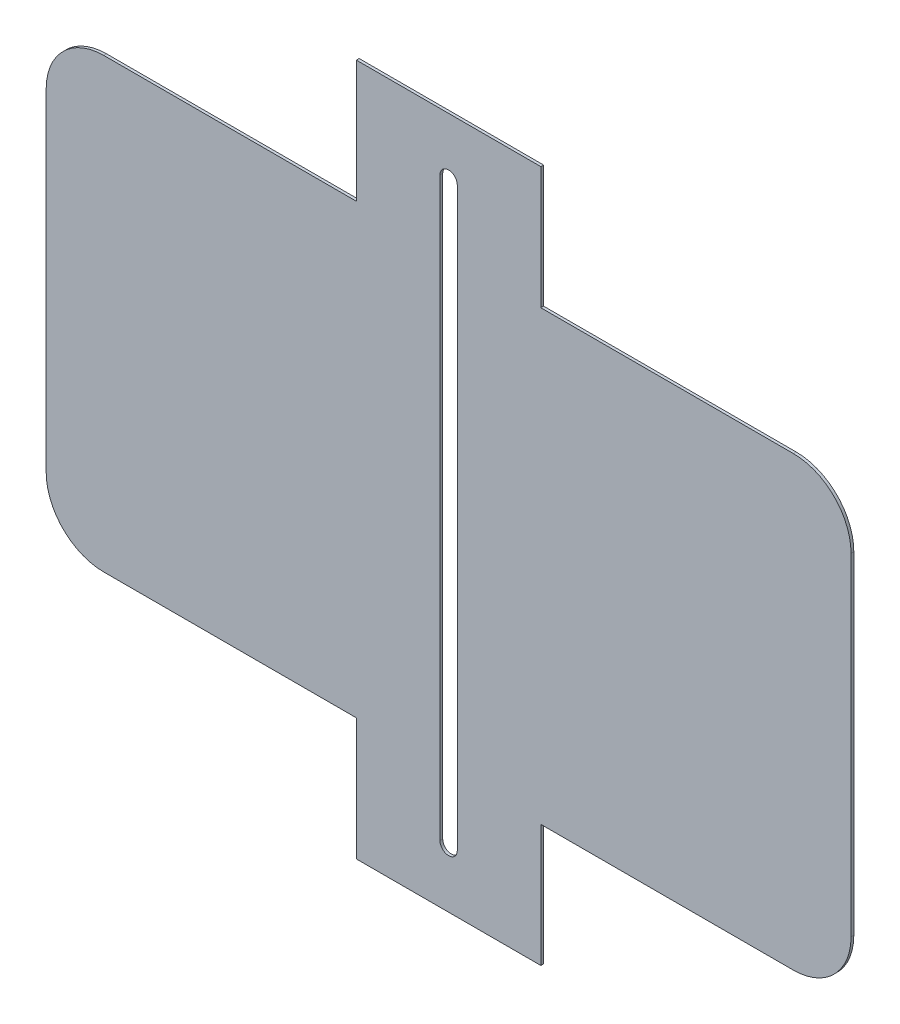
ISO-10303-21;
HEADER;
FILE_DESCRIPTION(('STEP AP214'),'2;1');
FILE_NAME('part.step','',(''),(''),'','','');
FILE_SCHEMA(('AUTOMOTIVE_DESIGN { 1 0 10303 214 1 1 1 1 }'));
ENDSEC;
DATA;
#1=APPLICATION_CONTEXT('core data for automotive mechanical design processes');
#2=APPLICATION_PROTOCOL_DEFINITION('international standard','automotive_design',2000,#1);
#3=PRODUCT_CONTEXT('',#1,'mechanical');
#4=PRODUCT('Part','Part','',(#3));
#5=PRODUCT_RELATED_PRODUCT_CATEGORY('part','',(#4));
#6=PRODUCT_DEFINITION_FORMATION('','',#4);
#7=PRODUCT_DEFINITION_CONTEXT('part definition',#1,'design');
#8=PRODUCT_DEFINITION('design','',#6,#7);
#9=PRODUCT_DEFINITION_SHAPE('','',#8);
#10=(LENGTH_UNIT() NAMED_UNIT(*) SI_UNIT(.MILLI.,.METRE.));
#11=(NAMED_UNIT(*) PLANE_ANGLE_UNIT() SI_UNIT($,.RADIAN.));
#12=(NAMED_UNIT(*) SI_UNIT($,.STERADIAN.) SOLID_ANGLE_UNIT());
#13=UNCERTAINTY_MEASURE_WITH_UNIT(LENGTH_MEASURE(1.E-05),#10,'distance_accuracy_value','');
#14=(GEOMETRIC_REPRESENTATION_CONTEXT(3) GLOBAL_UNCERTAINTY_ASSIGNED_CONTEXT((#13)) GLOBAL_UNIT_ASSIGNED_CONTEXT((#10,
#11,#12)) REPRESENTATION_CONTEXT('',''));
#15=CARTESIAN_POINT('',(0.,0.,0.));
#16=DIRECTION('',(0.,0.,1.));
#17=DIRECTION('',(1.,0.,0.));
#18=AXIS2_PLACEMENT_3D('',#15,#16,#17);
#19=CARTESIAN_POINT('',(0.750000000000006,0.,0.24));
#20=DIRECTION('',(-1.,0.,0.));
#21=DIRECTION('',(0.,0.,1.));
#22=AXIS2_PLACEMENT_3D('',#19,#20,#21);
#23=PLANE('',#22);
#24=DIRECTION('',(0.,1.,0.));
#25=VECTOR('',#24,1.);
#26=CARTESIAN_POINT('',(0.750000000000006,0.,0.));
#27=LINE('',#26,#25);
#28=CARTESIAN_POINT('',(0.750000000000006,-25.,0.));
#29=VERTEX_POINT('',#28);
#30=CARTESIAN_POINT('',(0.750000000000006,25.,0.));
#31=VERTEX_POINT('',#30);
#32=EDGE_CURVE('E310',#29,#31,#27,.T.);
#33=ORIENTED_EDGE('',*,*,#32,.F.);
#34=DIRECTION('',(0.,0.,-1.));
#35=VECTOR('',#34,1.);
#36=CARTESIAN_POINT('',(0.750000000000006,-25.,0.24));
#37=LINE('',#36,#35);
#38=CARTESIAN_POINT('',(0.750000000000006,-25.,0.24));
#39=VERTEX_POINT('',#38);
#40=EDGE_CURVE('E11',#39,#29,#37,.T.);
#41=ORIENTED_EDGE('',*,*,#40,.F.);
#42=DIRECTION('',(0.,1.,0.));
#43=VECTOR('',#42,1.);
#44=CARTESIAN_POINT('',(0.750000000000006,0.,0.24));
#45=LINE('',#44,#43);
#46=CARTESIAN_POINT('',(0.750000000000006,25.,0.24));
#47=VERTEX_POINT('',#46);
#48=EDGE_CURVE('E286',#39,#47,#45,.T.);
#49=ORIENTED_EDGE('',*,*,#48,.T.);
#50=DIRECTION('',(0.,0.,-1.));
#51=VECTOR('',#50,1.);
#52=CARTESIAN_POINT('',(0.750000000000006,25.,0.24));
#53=LINE('',#52,#51);
#54=EDGE_CURVE('E321',#47,#31,#53,.T.);
#55=ORIENTED_EDGE('',*,*,#54,.T.);
#56=EDGE_LOOP('',(#33,#41,#49,#55));
#57=FACE_BOUND('',#56,.T.);
#58=ADVANCED_FACE('F38',(#57),#23,.T.);
#59=CARTESIAN_POINT('',(0.,-25.,0.24));
#60=DIRECTION('',(0.,0.,-1.));
#61=DIRECTION('',(-1.,0.,0.));
#62=AXIS2_PLACEMENT_3D('',#59,#60,#61);
#63=CYLINDRICAL_SURFACE('',#62,0.750000000000006);
#64=CARTESIAN_POINT('',(0.,-25.,0.));
#65=DIRECTION('',(0.,0.,1.));
#66=DIRECTION('',(1.,0.,0.));
#67=AXIS2_PLACEMENT_3D('',#64,#65,#66);
#68=CIRCLE('',#67,0.750000000000006);
#69=CARTESIAN_POINT('',(-0.750000000000006,-25.,0.));
#70=VERTEX_POINT('',#69);
#71=EDGE_CURVE('E313',#29,#70,#68,.F.);
#72=ORIENTED_EDGE('',*,*,#71,.T.);
#73=DIRECTION('',(0.,0.,-1.));
#74=VECTOR('',#73,1.);
#75=CARTESIAN_POINT('',(-0.750000000000006,-25.,0.24));
#76=LINE('',#75,#74);
#77=CARTESIAN_POINT('',(-0.750000000000006,-25.,0.24));
#78=VERTEX_POINT('',#77);
#79=EDGE_CURVE('E47',#78,#70,#76,.T.);
#80=ORIENTED_EDGE('',*,*,#79,.F.);
#81=CARTESIAN_POINT('',(0.,-25.,0.24));
#82=DIRECTION('',(0.,0.,1.));
#83=DIRECTION('',(1.,0.,0.));
#84=AXIS2_PLACEMENT_3D('',#81,#82,#83);
#85=CIRCLE('',#84,0.750000000000006);
#86=EDGE_CURVE('E289',#39,#78,#85,.F.);
#87=ORIENTED_EDGE('',*,*,#86,.F.);
#88=ORIENTED_EDGE('',*,*,#40,.T.);
#89=EDGE_LOOP('',(#72,#80,#87,#88));
#90=FACE_BOUND('',#89,.T.);
#91=ADVANCED_FACE('F396',(#90),#63,.F.);
#92=CARTESIAN_POINT('',(-0.750000000000006,0.,0.24));
#93=DIRECTION('',(1.,0.,0.));
#94=DIRECTION('',(0.,0.,-1.));
#95=AXIS2_PLACEMENT_3D('',#92,#93,#94);
#96=PLANE('',#95);
#97=DIRECTION('',(0.,-1.,0.));
#98=VECTOR('',#97,1.);
#99=CARTESIAN_POINT('',(-0.750000000000006,0.,0.));
#100=LINE('',#99,#98);
#101=CARTESIAN_POINT('',(-0.750000000000006,25.,0.));
#102=VERTEX_POINT('',#101);
#103=EDGE_CURVE('E316',#102,#70,#100,.T.);
#104=ORIENTED_EDGE('',*,*,#103,.F.);
#105=DIRECTION('',(0.,0.,-1.));
#106=VECTOR('',#105,1.);
#107=CARTESIAN_POINT('',(-0.750000000000006,25.,0.24));
#108=LINE('',#107,#106);
#109=CARTESIAN_POINT('',(-0.750000000000006,25.,0.24));
#110=VERTEX_POINT('',#109);
#111=EDGE_CURVE('E323',#110,#102,#108,.T.);
#112=ORIENTED_EDGE('',*,*,#111,.F.);
#113=DIRECTION('',(0.,-1.,0.));
#114=VECTOR('',#113,1.);
#115=CARTESIAN_POINT('',(-0.750000000000006,0.,0.24));
#116=LINE('',#115,#114);
#117=EDGE_CURVE('E291',#110,#78,#116,.T.);
#118=ORIENTED_EDGE('',*,*,#117,.T.);
#119=ORIENTED_EDGE('',*,*,#79,.T.);
#120=EDGE_LOOP('',(#104,#112,#118,#119));
#121=FACE_BOUND('',#120,.T.);
#122=ADVANCED_FACE('F402',(#121),#96,.T.);
#123=CARTESIAN_POINT('',(-8.00000000000002,0.,0.24));
#124=DIRECTION('',(-1.,0.,0.));
#125=DIRECTION('',(0.,-1.,0.));
#126=AXIS2_PLACEMENT_3D('',#123,#124,#125);
#127=PLANE('',#126);
#128=DIRECTION('',(0.,1.,0.));
#129=VECTOR('',#128,1.);
#130=CARTESIAN_POINT('',(-8.00000000000002,0.,0.));
#131=LINE('',#130,#129);
#132=CARTESIAN_POINT('',(-8.00000000000002,-30.,0.));
#133=VERTEX_POINT('',#132);
#134=CARTESIAN_POINT('',(-8.00000000000002,-19.4,0.));
#135=VERTEX_POINT('',#134);
#136=EDGE_CURVE('E55',#133,#135,#131,.T.);
#137=ORIENTED_EDGE('',*,*,#136,.F.);
#138=DIRECTION('',(0.,0.,-1.));
#139=VECTOR('',#138,1.);
#140=CARTESIAN_POINT('',(-8.00000000000002,-30.,0.24));
#141=LINE('',#140,#139);
#142=CARTESIAN_POINT('',(-8.00000000000002,-30.,0.24));
#143=VERTEX_POINT('',#142);
#144=EDGE_CURVE('E42',#143,#133,#141,.T.);
#145=ORIENTED_EDGE('',*,*,#144,.F.);
#146=DIRECTION('',(0.,1.,0.));
#147=VECTOR('',#146,1.);
#148=CARTESIAN_POINT('',(-8.00000000000002,0.,0.24));
#149=LINE('',#148,#147);
#150=CARTESIAN_POINT('',(-8.00000000000002,-19.4,0.24));
#151=VERTEX_POINT('',#150);
#152=EDGE_CURVE('E272',#143,#151,#149,.T.);
#153=ORIENTED_EDGE('',*,*,#152,.T.);
#154=DIRECTION('',(0.,0.,1.));
#155=VECTOR('',#154,1.);
#156=CARTESIAN_POINT('',(-8.00000000000002,-19.4,0.));
#157=LINE('',#156,#155);
#158=EDGE_CURVE('E189',#135,#151,#157,.T.);
#159=ORIENTED_EDGE('',*,*,#158,.F.);
#160=EDGE_LOOP('',(#137,#145,#153,#159));
#161=FACE_BOUND('',#160,.T.);
#162=ADVANCED_FACE('F40',(#161),#127,.T.);
#163=CARTESIAN_POINT('',(0.,-30.,0.24));
#164=DIRECTION('',(0.,1.,0.));
#165=DIRECTION('',(0.,0.,1.));
#166=AXIS2_PLACEMENT_3D('',#163,#164,#165);
#167=PLANE('',#166);
#168=DIRECTION('',(1.,0.,0.));
#169=VECTOR('',#168,1.);
#170=CARTESIAN_POINT('',(0.,-30.,0.));
#171=LINE('',#170,#169);
#172=CARTESIAN_POINT('',(8.00000000000003,-30.,0.));
#173=VERTEX_POINT('',#172);
#174=EDGE_CURVE('E299',#133,#173,#171,.T.);
#175=ORIENTED_EDGE('',*,*,#174,.T.);
#176=DIRECTION('',(0.,0.,-1.));
#177=VECTOR('',#176,1.);
#178=CARTESIAN_POINT('',(8.00000000000003,-30.,0.24));
#179=LINE('',#178,#177);
#180=CARTESIAN_POINT('',(8.00000000000003,-30.,0.24));
#181=VERTEX_POINT('',#180);
#182=EDGE_CURVE('E328',#181,#173,#179,.T.);
#183=ORIENTED_EDGE('',*,*,#182,.F.);
#184=DIRECTION('',(1.,0.,0.));
#185=VECTOR('',#184,1.);
#186=CARTESIAN_POINT('',(0.,-30.,0.24));
#187=LINE('',#186,#185);
#188=EDGE_CURVE('E274',#143,#181,#187,.T.);
#189=ORIENTED_EDGE('',*,*,#188,.F.);
#190=ORIENTED_EDGE('',*,*,#144,.T.);
#191=EDGE_LOOP('',(#175,#183,#189,#190));
#192=FACE_BOUND('',#191,.T.);
#193=ADVANCED_FACE('F336',(#192),#167,.F.);
#194=CARTESIAN_POINT('',(8.00000000000003,0.,0.24));
#195=DIRECTION('',(-1.,0.,0.));
#196=DIRECTION('',(0.,-1.,0.));
#197=AXIS2_PLACEMENT_3D('',#194,#195,#196);
#198=PLANE('',#197);
#199=DIRECTION('',(0.,1.,0.));
#200=VECTOR('',#199,1.);
#201=CARTESIAN_POINT('',(8.00000000000003,0.,0.));
#202=LINE('',#201,#200);
#203=CARTESIAN_POINT('',(8.00000000000002,-19.4,0.));
#204=VERTEX_POINT('',#203);
#205=EDGE_CURVE('E301',#173,#204,#202,.T.);
#206=ORIENTED_EDGE('',*,*,#205,.T.);
#207=DIRECTION('',(0.,0.,1.));
#208=VECTOR('',#207,1.);
#209=CARTESIAN_POINT('',(8.00000000000002,-19.4,0.));
#210=LINE('',#209,#208);
#211=CARTESIAN_POINT('',(8.00000000000002,-19.4,0.24));
#212=VERTEX_POINT('',#211);
#213=EDGE_CURVE('E238',#204,#212,#210,.T.);
#214=ORIENTED_EDGE('',*,*,#213,.T.);
#215=DIRECTION('',(0.,1.,0.));
#216=VECTOR('',#215,1.);
#217=CARTESIAN_POINT('',(8.00000000000003,0.,0.24));
#218=LINE('',#217,#216);
#219=EDGE_CURVE('E277',#181,#212,#218,.T.);
#220=ORIENTED_EDGE('',*,*,#219,.F.);
#221=ORIENTED_EDGE('',*,*,#182,.T.);
#222=EDGE_LOOP('',(#206,#214,#220,#221));
#223=FACE_BOUND('',#222,.T.);
#224=ADVANCED_FACE('F384',(#223),#198,.F.);
#225=CARTESIAN_POINT('',(8.00000000000003,0.,0.24));
#226=DIRECTION('',(1.,0.,0.));
#227=DIRECTION('',(0.,1.,0.));
#228=AXIS2_PLACEMENT_3D('',#225,#226,#227);
#229=PLANE('',#228);
#230=DIRECTION('',(0.,-1.,0.));
#231=VECTOR('',#230,1.);
#232=CARTESIAN_POINT('',(8.00000000000003,0.,0.));
#233=LINE('',#232,#231);
#234=CARTESIAN_POINT('',(8.00000000000003,30.,0.));
#235=VERTEX_POINT('',#234);
#236=CARTESIAN_POINT('',(8.00000000000003,19.4,0.));
#237=VERTEX_POINT('',#236);
#238=EDGE_CURVE('E303',#235,#237,#233,.T.);
#239=ORIENTED_EDGE('',*,*,#238,.F.);
#240=DIRECTION('',(0.,0.,-1.));
#241=VECTOR('',#240,1.);
#242=CARTESIAN_POINT('',(8.00000000000003,30.,0.24));
#243=LINE('',#242,#241);
#244=CARTESIAN_POINT('',(8.00000000000003,30.,0.24));
#245=VERTEX_POINT('',#244);
#246=EDGE_CURVE('E327',#245,#235,#243,.T.);
#247=ORIENTED_EDGE('',*,*,#246,.F.);
#248=DIRECTION('',(0.,-1.,0.));
#249=VECTOR('',#248,1.);
#250=CARTESIAN_POINT('',(8.00000000000003,0.,0.24));
#251=LINE('',#250,#249);
#252=CARTESIAN_POINT('',(8.00000000000003,19.4,0.24));
#253=VERTEX_POINT('',#252);
#254=EDGE_CURVE('E279',#245,#253,#251,.T.);
#255=ORIENTED_EDGE('',*,*,#254,.T.);
#256=DIRECTION('',(0.,0.,1.));
#257=VECTOR('',#256,1.);
#258=CARTESIAN_POINT('',(8.00000000000003,19.4,0.));
#259=LINE('',#258,#257);
#260=EDGE_CURVE('E241',#237,#253,#259,.T.);
#261=ORIENTED_EDGE('',*,*,#260,.F.);
#262=EDGE_LOOP('',(#239,#247,#255,#261));
#263=FACE_BOUND('',#262,.T.);
#264=ADVANCED_FACE('F366',(#263),#229,.T.);
#265=CARTESIAN_POINT('',(0.,30.,0.24));
#266=DIRECTION('',(0.,1.,0.));
#267=DIRECTION('',(0.,0.,1.));
#268=AXIS2_PLACEMENT_3D('',#265,#266,#267);
#269=PLANE('',#268);
#270=DIRECTION('',(1.,0.,0.));
#271=VECTOR('',#270,1.);
#272=CARTESIAN_POINT('',(0.,30.,0.));
#273=LINE('',#272,#271);
#274=CARTESIAN_POINT('',(-8.00000000000003,30.,0.));
#275=VERTEX_POINT('',#274);
#276=EDGE_CURVE('E305',#275,#235,#273,.T.);
#277=ORIENTED_EDGE('',*,*,#276,.F.);
#278=DIRECTION('',(0.,0.,-1.));
#279=VECTOR('',#278,1.);
#280=CARTESIAN_POINT('',(-8.00000000000003,30.,0.24));
#281=LINE('',#280,#279);
#282=CARTESIAN_POINT('',(-8.00000000000003,30.,0.24));
#283=VERTEX_POINT('',#282);
#284=EDGE_CURVE('E297',#283,#275,#281,.T.);
#285=ORIENTED_EDGE('',*,*,#284,.F.);
#286=DIRECTION('',(1.,0.,0.));
#287=VECTOR('',#286,1.);
#288=CARTESIAN_POINT('',(0.,30.,0.24));
#289=LINE('',#288,#287);
#290=EDGE_CURVE('E281',#283,#245,#289,.T.);
#291=ORIENTED_EDGE('',*,*,#290,.T.);
#292=ORIENTED_EDGE('',*,*,#246,.T.);
#293=EDGE_LOOP('',(#277,#285,#291,#292));
#294=FACE_BOUND('',#293,.T.);
#295=ADVANCED_FACE('F361',(#294),#269,.T.);
#296=CARTESIAN_POINT('',(-8.00000000000002,0.,0.24));
#297=DIRECTION('',(1.,0.,0.));
#298=DIRECTION('',(0.,1.,0.));
#299=AXIS2_PLACEMENT_3D('',#296,#297,#298);
#300=PLANE('',#299);
#301=DIRECTION('',(0.,-1.,0.));
#302=VECTOR('',#301,1.);
#303=CARTESIAN_POINT('',(-8.00000000000002,0.,0.));
#304=LINE('',#303,#302);
#305=CARTESIAN_POINT('',(-8.00000000000002,19.4,0.));
#306=VERTEX_POINT('',#305);
#307=EDGE_CURVE('E308',#275,#306,#304,.T.);
#308=ORIENTED_EDGE('',*,*,#307,.T.);
#309=DIRECTION('',(0.,0.,1.));
#310=VECTOR('',#309,1.);
#311=CARTESIAN_POINT('',(-8.00000000000002,19.4,0.));
#312=LINE('',#311,#310);
#313=CARTESIAN_POINT('',(-8.00000000000002,19.4,0.24));
#314=VERTEX_POINT('',#313);
#315=EDGE_CURVE('E222',#306,#314,#312,.T.);
#316=ORIENTED_EDGE('',*,*,#315,.T.);
#317=DIRECTION('',(0.,-1.,0.));
#318=VECTOR('',#317,1.);
#319=CARTESIAN_POINT('',(-8.00000000000002,0.,0.24));
#320=LINE('',#319,#318);
#321=EDGE_CURVE('E284',#283,#314,#320,.T.);
#322=ORIENTED_EDGE('',*,*,#321,.F.);
#323=ORIENTED_EDGE('',*,*,#284,.T.);
#324=EDGE_LOOP('',(#308,#316,#322,#323));
#325=FACE_BOUND('',#324,.T.);
#326=ADVANCED_FACE('F357',(#325),#300,.F.);
#327=CARTESIAN_POINT('',(0.,25.,0.24));
#328=DIRECTION('',(0.,0.,-1.));
#329=DIRECTION('',(-1.,0.,0.));
#330=AXIS2_PLACEMENT_3D('',#327,#328,#329);
#331=CYLINDRICAL_SURFACE('',#330,0.750000000000006);
#332=CARTESIAN_POINT('',(0.,25.,0.));
#333=DIRECTION('',(0.,0.,1.));
#334=DIRECTION('',(1.,0.,0.));
#335=AXIS2_PLACEMENT_3D('',#332,#333,#334);
#336=CIRCLE('',#335,0.750000000000006);
#337=EDGE_CURVE('E275',#31,#102,#336,.T.);
#338=ORIENTED_EDGE('',*,*,#337,.F.);
#339=ORIENTED_EDGE('',*,*,#54,.F.);
#340=CARTESIAN_POINT('',(0.,25.,0.24));
#341=DIRECTION('',(0.,0.,1.));
#342=DIRECTION('',(1.,0.,0.));
#343=AXIS2_PLACEMENT_3D('',#340,#341,#342);
#344=CIRCLE('',#343,0.750000000000006);
#345=EDGE_CURVE('E294',#47,#110,#344,.T.);
#346=ORIENTED_EDGE('',*,*,#345,.T.);
#347=ORIENTED_EDGE('',*,*,#111,.T.);
#348=EDGE_LOOP('',(#338,#339,#346,#347));
#349=FACE_BOUND('',#348,.T.);
#350=ADVANCED_FACE('F410',(#349),#331,.F.);
#351=CARTESIAN_POINT('',(0.,0.,0.24));
#352=DIRECTION('',(0.,0.,1.));
#353=DIRECTION('',(1.,0.,0.));
#354=AXIS2_PLACEMENT_3D('',#351,#352,#353);
#355=PLANE('',#354);
#356=ORIENTED_EDGE('',*,*,#321,.T.);
#357=DIRECTION('',(1.,0.,0.));
#358=VECTOR('',#357,1.);
#359=CARTESIAN_POINT('',(-29.9,19.4,0.24));
#360=LINE('',#359,#358);
#361=CARTESIAN_POINT('',(-29.9,19.4,0.24));
#362=VERTEX_POINT('',#361);
#363=EDGE_CURVE('E201',#362,#314,#360,.T.);
#364=ORIENTED_EDGE('',*,*,#363,.F.);
#365=CARTESIAN_POINT('',(-29.9,14.4,0.24));
#366=DIRECTION('',(0.,0.,-1.));
#367=DIRECTION('',(-1.,0.,0.));
#368=AXIS2_PLACEMENT_3D('',#365,#366,#367);
#369=CIRCLE('',#368,5.);
#370=CARTESIAN_POINT('',(-34.9,14.4,0.24));
#371=VERTEX_POINT('',#370);
#372=EDGE_CURVE('E204',#371,#362,#369,.T.);
#373=ORIENTED_EDGE('',*,*,#372,.F.);
#374=DIRECTION('',(0.,1.,0.));
#375=VECTOR('',#374,1.);
#376=CARTESIAN_POINT('',(-34.9,-14.4,0.24));
#377=LINE('',#376,#375);
#378=CARTESIAN_POINT('',(-34.9,-14.4,0.24));
#379=VERTEX_POINT('',#378);
#380=EDGE_CURVE('E217',#379,#371,#377,.T.);
#381=ORIENTED_EDGE('',*,*,#380,.F.);
#382=CARTESIAN_POINT('',(-29.9,-14.4,0.24));
#383=DIRECTION('',(0.,0.,-1.));
#384=DIRECTION('',(-1.,0.,0.));
#385=AXIS2_PLACEMENT_3D('',#382,#383,#384);
#386=CIRCLE('',#385,5.);
#387=CARTESIAN_POINT('',(-29.9,-19.4,0.24));
#388=VERTEX_POINT('',#387);
#389=EDGE_CURVE('E214',#388,#379,#386,.T.);
#390=ORIENTED_EDGE('',*,*,#389,.F.);
#391=DIRECTION('',(-1.,0.,0.));
#392=VECTOR('',#391,1.);
#393=CARTESIAN_POINT('',(-8.00000000000002,-19.4,0.24));
#394=LINE('',#393,#392);
#395=EDGE_CURVE('E184',#151,#388,#394,.T.);
#396=ORIENTED_EDGE('',*,*,#395,.F.);
#397=ORIENTED_EDGE('',*,*,#152,.F.);
#398=ORIENTED_EDGE('',*,*,#188,.T.);
#399=ORIENTED_EDGE('',*,*,#219,.T.);
#400=DIRECTION('',(-1.,0.,0.));
#401=VECTOR('',#400,1.);
#402=CARTESIAN_POINT('',(8.00000000000002,-19.4,0.24));
#403=LINE('',#402,#401);
#404=CARTESIAN_POINT('',(29.9,-19.4,0.24));
#405=VERTEX_POINT('',#404);
#406=EDGE_CURVE('E249',#405,#212,#403,.T.);
#407=ORIENTED_EDGE('',*,*,#406,.F.);
#408=CARTESIAN_POINT('',(29.9,-14.4,0.24));
#409=DIRECTION('',(0.,0.,-1.));
#410=DIRECTION('',(1.,0.,0.));
#411=AXIS2_PLACEMENT_3D('',#408,#409,#410);
#412=CIRCLE('',#411,5.);
#413=CARTESIAN_POINT('',(34.9,-14.4,0.24));
#414=VERTEX_POINT('',#413);
#415=EDGE_CURVE('E253',#414,#405,#412,.T.);
#416=ORIENTED_EDGE('',*,*,#415,.F.);
#417=DIRECTION('',(0.,-1.,0.));
#418=VECTOR('',#417,1.);
#419=CARTESIAN_POINT('',(34.9,-14.4,0.24));
#420=LINE('',#419,#418);
#421=CARTESIAN_POINT('',(34.9,14.4,0.24));
#422=VERTEX_POINT('',#421);
#423=EDGE_CURVE('E256',#422,#414,#420,.T.);
#424=ORIENTED_EDGE('',*,*,#423,.F.);
#425=CARTESIAN_POINT('',(29.9,14.4,0.24));
#426=DIRECTION('',(0.,0.,-1.));
#427=DIRECTION('',(1.,0.,0.));
#428=AXIS2_PLACEMENT_3D('',#425,#426,#427);
#429=CIRCLE('',#428,5.);
#430=CARTESIAN_POINT('',(29.9,19.4,0.24));
#431=VERTEX_POINT('',#430);
#432=EDGE_CURVE('E215',#431,#422,#429,.T.);
#433=ORIENTED_EDGE('',*,*,#432,.F.);
#434=DIRECTION('',(1.,0.,0.));
#435=VECTOR('',#434,1.);
#436=CARTESIAN_POINT('',(29.9,19.4,0.24));
#437=LINE('',#436,#435);
#438=EDGE_CURVE('E246',#253,#431,#437,.T.);
#439=ORIENTED_EDGE('',*,*,#438,.F.);
#440=ORIENTED_EDGE('',*,*,#254,.F.);
#441=ORIENTED_EDGE('',*,*,#290,.F.);
#442=EDGE_LOOP('',(#356,#364,#373,#381,#390,#396,#397,#398,#399,#407,#416,#424,#433,#439,#440,#441));
#443=FACE_BOUND('',#442,.T.);
#444=ORIENTED_EDGE('',*,*,#48,.F.);
#445=ORIENTED_EDGE('',*,*,#86,.T.);
#446=ORIENTED_EDGE('',*,*,#117,.F.);
#447=ORIENTED_EDGE('',*,*,#345,.F.);
#448=EDGE_LOOP('',(#444,#445,#446,#447));
#449=FACE_BOUND('',#448,.T.);
#450=ADVANCED_FACE('F340',(#443,#449),#355,.T.);
#451=CARTESIAN_POINT('',(0.,0.,0.));
#452=DIRECTION('',(0.,0.,1.));
#453=DIRECTION('',(1.,0.,0.));
#454=AXIS2_PLACEMENT_3D('',#451,#452,#453);
#455=PLANE('',#454);
#456=DIRECTION('',(1.,0.,0.));
#457=VECTOR('',#456,1.);
#458=CARTESIAN_POINT('',(-29.9,19.4,0.));
#459=LINE('',#458,#457);
#460=CARTESIAN_POINT('',(-29.9,19.4,0.));
#461=VERTEX_POINT('',#460);
#462=EDGE_CURVE('E211',#461,#306,#459,.T.);
#463=ORIENTED_EDGE('',*,*,#462,.T.);
#464=ORIENTED_EDGE('',*,*,#307,.F.);
#465=ORIENTED_EDGE('',*,*,#276,.T.);
#466=ORIENTED_EDGE('',*,*,#238,.T.);
#467=DIRECTION('',(1.,0.,0.));
#468=VECTOR('',#467,1.);
#469=CARTESIAN_POINT('',(29.9,19.4,0.));
#470=LINE('',#469,#468);
#471=CARTESIAN_POINT('',(29.9,19.4,0.));
#472=VERTEX_POINT('',#471);
#473=EDGE_CURVE('E233',#237,#472,#470,.T.);
#474=ORIENTED_EDGE('',*,*,#473,.T.);
#475=CARTESIAN_POINT('',(29.9,14.4,0.));
#476=DIRECTION('',(0.,0.,-1.));
#477=DIRECTION('',(1.,0.,0.));
#478=AXIS2_PLACEMENT_3D('',#475,#476,#477);
#479=CIRCLE('',#478,5.);
#480=CARTESIAN_POINT('',(34.9,14.4,0.));
#481=VERTEX_POINT('',#480);
#482=EDGE_CURVE('E250',#472,#481,#479,.T.);
#483=ORIENTED_EDGE('',*,*,#482,.T.);
#484=DIRECTION('',(0.,-1.,0.));
#485=VECTOR('',#484,1.);
#486=CARTESIAN_POINT('',(34.9,-14.4,0.));
#487=LINE('',#486,#485);
#488=CARTESIAN_POINT('',(34.9,-14.4,0.));
#489=VERTEX_POINT('',#488);
#490=EDGE_CURVE('E267',#481,#489,#487,.T.);
#491=ORIENTED_EDGE('',*,*,#490,.T.);
#492=CARTESIAN_POINT('',(29.9,-14.4,0.));
#493=DIRECTION('',(0.,0.,-1.));
#494=DIRECTION('',(1.,0.,0.));
#495=AXIS2_PLACEMENT_3D('',#492,#493,#494);
#496=CIRCLE('',#495,5.);
#497=CARTESIAN_POINT('',(29.9,-19.4,0.));
#498=VERTEX_POINT('',#497);
#499=EDGE_CURVE('E63',#489,#498,#496,.T.);
#500=ORIENTED_EDGE('',*,*,#499,.T.);
#501=DIRECTION('',(-1.,0.,0.));
#502=VECTOR('',#501,1.);
#503=CARTESIAN_POINT('',(8.00000000000002,-19.4,0.));
#504=LINE('',#503,#502);
#505=EDGE_CURVE('E263',#498,#204,#504,.T.);
#506=ORIENTED_EDGE('',*,*,#505,.T.);
#507=ORIENTED_EDGE('',*,*,#205,.F.);
#508=ORIENTED_EDGE('',*,*,#174,.F.);
#509=ORIENTED_EDGE('',*,*,#136,.T.);
#510=DIRECTION('',(-1.,0.,0.));
#511=VECTOR('',#510,1.);
#512=CARTESIAN_POINT('',(-8.00000000000002,-19.4,0.));
#513=LINE('',#512,#511);
#514=CARTESIAN_POINT('',(-29.9,-19.4,0.));
#515=VERTEX_POINT('',#514);
#516=EDGE_CURVE('E181',#135,#515,#513,.T.);
#517=ORIENTED_EDGE('',*,*,#516,.T.);
#518=CARTESIAN_POINT('',(-29.9,-14.4,0.));
#519=DIRECTION('',(0.,0.,-1.));
#520=DIRECTION('',(-1.,0.,0.));
#521=AXIS2_PLACEMENT_3D('',#518,#519,#520);
#522=CIRCLE('',#521,5.);
#523=CARTESIAN_POINT('',(-34.9,-14.4,0.));
#524=VERTEX_POINT('',#523);
#525=EDGE_CURVE('E192',#515,#524,#522,.T.);
#526=ORIENTED_EDGE('',*,*,#525,.T.);
#527=DIRECTION('',(0.,1.,0.));
#528=VECTOR('',#527,1.);
#529=CARTESIAN_POINT('',(-34.9,-14.4,0.));
#530=LINE('',#529,#528);
#531=CARTESIAN_POINT('',(-34.9,14.4,0.));
#532=VERTEX_POINT('',#531);
#533=EDGE_CURVE('E196',#524,#532,#530,.T.);
#534=ORIENTED_EDGE('',*,*,#533,.T.);
#535=CARTESIAN_POINT('',(-29.9,14.4,0.));
#536=DIRECTION('',(0.,0.,-1.));
#537=DIRECTION('',(-1.,0.,0.));
#538=AXIS2_PLACEMENT_3D('',#535,#536,#537);
#539=CIRCLE('',#538,5.);
#540=EDGE_CURVE('E208',#532,#461,#539,.T.);
#541=ORIENTED_EDGE('',*,*,#540,.T.);
#542=EDGE_LOOP('',(#463,#464,#465,#466,#474,#483,#491,#500,#506,#507,#508,#509,#517,#526,#534,#541));
#543=FACE_BOUND('',#542,.T.);
#544=ORIENTED_EDGE('',*,*,#32,.T.);
#545=ORIENTED_EDGE('',*,*,#337,.T.);
#546=ORIENTED_EDGE('',*,*,#103,.T.);
#547=ORIENTED_EDGE('',*,*,#71,.F.);
#548=EDGE_LOOP('',(#544,#545,#546,#547));
#549=FACE_BOUND('',#548,.T.);
#550=ADVANCED_FACE('F199',(#543,#549),#455,.F.);
#551=CARTESIAN_POINT('',(29.9,14.4,0.));
#552=DIRECTION('',(0.,0.,1.));
#553=DIRECTION('',(1.,0.,0.));
#554=AXIS2_PLACEMENT_3D('',#551,#552,#553);
#555=CYLINDRICAL_SURFACE('',#554,5.);
#556=ORIENTED_EDGE('',*,*,#432,.T.);
#557=DIRECTION('',(0.,0.,1.));
#558=VECTOR('',#557,1.);
#559=CARTESIAN_POINT('',(34.9,14.4,0.));
#560=LINE('',#559,#558);
#561=EDGE_CURVE('E231',#481,#422,#560,.T.);
#562=ORIENTED_EDGE('',*,*,#561,.F.);
#563=ORIENTED_EDGE('',*,*,#482,.F.);
#564=DIRECTION('',(0.,0.,1.));
#565=VECTOR('',#564,1.);
#566=CARTESIAN_POINT('',(29.9,19.4,0.));
#567=LINE('',#566,#565);
#568=EDGE_CURVE('E244',#472,#431,#567,.T.);
#569=ORIENTED_EDGE('',*,*,#568,.T.);
#570=EDGE_LOOP('',(#556,#562,#563,#569));
#571=FACE_BOUND('',#570,.T.);
#572=ADVANCED_FACE('F374',(#571),#555,.T.);
#573=CARTESIAN_POINT('',(29.9,19.4,0.));
#574=DIRECTION('',(0.,-1.,0.));
#575=DIRECTION('',(0.,0.,-1.));
#576=AXIS2_PLACEMENT_3D('',#573,#574,#575);
#577=PLANE('',#576);
#578=ORIENTED_EDGE('',*,*,#438,.T.);
#579=ORIENTED_EDGE('',*,*,#568,.F.);
#580=ORIENTED_EDGE('',*,*,#473,.F.);
#581=ORIENTED_EDGE('',*,*,#260,.T.);
#582=EDGE_LOOP('',(#578,#579,#580,#581));
#583=FACE_BOUND('',#582,.T.);
#584=ADVANCED_FACE('F370',(#583),#577,.F.);
#585=CARTESIAN_POINT('',(8.00000000000002,-19.4,0.));
#586=DIRECTION('',(0.,1.,0.));
#587=DIRECTION('',(-1.,0.,0.));
#588=AXIS2_PLACEMENT_3D('',#585,#586,#587);
#589=PLANE('',#588);
#590=ORIENTED_EDGE('',*,*,#406,.T.);
#591=ORIENTED_EDGE('',*,*,#213,.F.);
#592=ORIENTED_EDGE('',*,*,#505,.F.);
#593=DIRECTION('',(0.,0.,1.));
#594=VECTOR('',#593,1.);
#595=CARTESIAN_POINT('',(29.9,-19.4,0.));
#596=LINE('',#595,#594);
#597=EDGE_CURVE('E236',#498,#405,#596,.T.);
#598=ORIENTED_EDGE('',*,*,#597,.T.);
#599=EDGE_LOOP('',(#590,#591,#592,#598));
#600=FACE_BOUND('',#599,.T.);
#601=ADVANCED_FACE('F382',(#600),#589,.F.);
#602=CARTESIAN_POINT('',(29.9,-14.4,0.));
#603=DIRECTION('',(0.,0.,1.));
#604=DIRECTION('',(1.,0.,0.));
#605=AXIS2_PLACEMENT_3D('',#602,#603,#604);
#606=CYLINDRICAL_SURFACE('',#605,5.);
#607=ORIENTED_EDGE('',*,*,#415,.T.);
#608=ORIENTED_EDGE('',*,*,#597,.F.);
#609=ORIENTED_EDGE('',*,*,#499,.F.);
#610=DIRECTION('',(0.,0.,1.));
#611=VECTOR('',#610,1.);
#612=CARTESIAN_POINT('',(34.9,-14.4,0.));
#613=LINE('',#612,#611);
#614=EDGE_CURVE('E234',#489,#414,#613,.T.);
#615=ORIENTED_EDGE('',*,*,#614,.T.);
#616=EDGE_LOOP('',(#607,#608,#609,#615));
#617=FACE_BOUND('',#616,.T.);
#618=ADVANCED_FACE('F386',(#617),#606,.T.);
#619=CARTESIAN_POINT('',(34.9,-14.4,0.));
#620=DIRECTION('',(-1.,0.,0.));
#621=DIRECTION('',(0.,0.,1.));
#622=AXIS2_PLACEMENT_3D('',#619,#620,#621);
#623=PLANE('',#622);
#624=ORIENTED_EDGE('',*,*,#423,.T.);
#625=ORIENTED_EDGE('',*,*,#614,.F.);
#626=ORIENTED_EDGE('',*,*,#490,.F.);
#627=ORIENTED_EDGE('',*,*,#561,.T.);
#628=EDGE_LOOP('',(#624,#625,#626,#627));
#629=FACE_BOUND('',#628,.T.);
#630=ADVANCED_FACE('F378',(#629),#623,.F.);
#631=CARTESIAN_POINT('',(-29.9,19.4,0.));
#632=DIRECTION('',(0.,-1.,0.));
#633=DIRECTION('',(0.,0.,-1.));
#634=AXIS2_PLACEMENT_3D('',#631,#632,#633);
#635=PLANE('',#634);
#636=ORIENTED_EDGE('',*,*,#363,.T.);
#637=ORIENTED_EDGE('',*,*,#315,.F.);
#638=ORIENTED_EDGE('',*,*,#462,.F.);
#639=DIRECTION('',(0.,0.,1.));
#640=VECTOR('',#639,1.);
#641=CARTESIAN_POINT('',(-29.9,19.4,0.));
#642=LINE('',#641,#640);
#643=EDGE_CURVE('E225',#461,#362,#642,.T.);
#644=ORIENTED_EDGE('',*,*,#643,.T.);
#645=EDGE_LOOP('',(#636,#637,#638,#644));
#646=FACE_BOUND('',#645,.T.);
#647=ADVANCED_FACE('F354',(#646),#635,.F.);
#648=CARTESIAN_POINT('',(-29.9,14.4,0.));
#649=DIRECTION('',(0.,0.,1.));
#650=DIRECTION('',(1.,0.,0.));
#651=AXIS2_PLACEMENT_3D('',#648,#649,#650);
#652=CYLINDRICAL_SURFACE('',#651,5.);
#653=ORIENTED_EDGE('',*,*,#372,.T.);
#654=ORIENTED_EDGE('',*,*,#643,.F.);
#655=ORIENTED_EDGE('',*,*,#540,.F.);
#656=DIRECTION('',(0.,0.,1.));
#657=VECTOR('',#656,1.);
#658=CARTESIAN_POINT('',(-34.9,14.4,0.));
#659=LINE('',#658,#657);
#660=EDGE_CURVE('E227',#532,#371,#659,.T.);
#661=ORIENTED_EDGE('',*,*,#660,.T.);
#662=EDGE_LOOP('',(#653,#654,#655,#661));
#663=FACE_BOUND('',#662,.T.);
#664=ADVANCED_FACE('F351',(#663),#652,.T.);
#665=CARTESIAN_POINT('',(-34.9,-14.4,0.));
#666=DIRECTION('',(1.,0.,0.));
#667=DIRECTION('',(0.,0.,-1.));
#668=AXIS2_PLACEMENT_3D('',#665,#666,#667);
#669=PLANE('',#668);
#670=ORIENTED_EDGE('',*,*,#380,.T.);
#671=ORIENTED_EDGE('',*,*,#660,.F.);
#672=ORIENTED_EDGE('',*,*,#533,.F.);
#673=DIRECTION('',(0.,0.,1.));
#674=VECTOR('',#673,1.);
#675=CARTESIAN_POINT('',(-34.9,-14.4,0.));
#676=LINE('',#675,#674);
#677=EDGE_CURVE('E188',#524,#379,#676,.T.);
#678=ORIENTED_EDGE('',*,*,#677,.T.);
#679=EDGE_LOOP('',(#670,#671,#672,#678));
#680=FACE_BOUND('',#679,.T.);
#681=ADVANCED_FACE('F346',(#680),#669,.F.);
#682=CARTESIAN_POINT('',(-29.9,-14.4,0.));
#683=DIRECTION('',(0.,0.,1.));
#684=DIRECTION('',(1.,0.,0.));
#685=AXIS2_PLACEMENT_3D('',#682,#683,#684);
#686=CYLINDRICAL_SURFACE('',#685,5.);
#687=ORIENTED_EDGE('',*,*,#389,.T.);
#688=ORIENTED_EDGE('',*,*,#677,.F.);
#689=ORIENTED_EDGE('',*,*,#525,.F.);
#690=DIRECTION('',(0.,0.,1.));
#691=VECTOR('',#690,1.);
#692=CARTESIAN_POINT('',(-29.9,-19.4,0.));
#693=LINE('',#692,#691);
#694=EDGE_CURVE('E177',#515,#388,#693,.T.);
#695=ORIENTED_EDGE('',*,*,#694,.T.);
#696=EDGE_LOOP('',(#687,#688,#689,#695));
#697=FACE_BOUND('',#696,.T.);
#698=ADVANCED_FACE('F193',(#697),#686,.T.);
#699=CARTESIAN_POINT('',(-8.00000000000002,-19.4,0.));
#700=DIRECTION('',(0.,1.,0.));
#701=DIRECTION('',(-1.,0.,0.));
#702=AXIS2_PLACEMENT_3D('',#699,#700,#701);
#703=PLANE('',#702);
#704=ORIENTED_EDGE('',*,*,#395,.T.);
#705=ORIENTED_EDGE('',*,*,#694,.F.);
#706=ORIENTED_EDGE('',*,*,#516,.F.);
#707=ORIENTED_EDGE('',*,*,#158,.T.);
#708=EDGE_LOOP('',(#704,#705,#706,#707));
#709=FACE_BOUND('',#708,.T.);
#710=ADVANCED_FACE('F179',(#709),#703,.F.);
#711=CLOSED_SHELL('',(#58,#91,#122,#162,#193,#224,#264,#295,#326,#350,#450,#550,#572,#584,#601,
#618,#630,#647,#664,#681,#698,#710));
#712=MANIFOLD_SOLID_BREP('B2',#711);
#713=ADVANCED_BREP_SHAPE_REPRESENTATION('',(#18,#712),#14);
#714=SHAPE_DEFINITION_REPRESENTATION(#9,#713);
ENDSEC;
END-ISO-10303-21;
